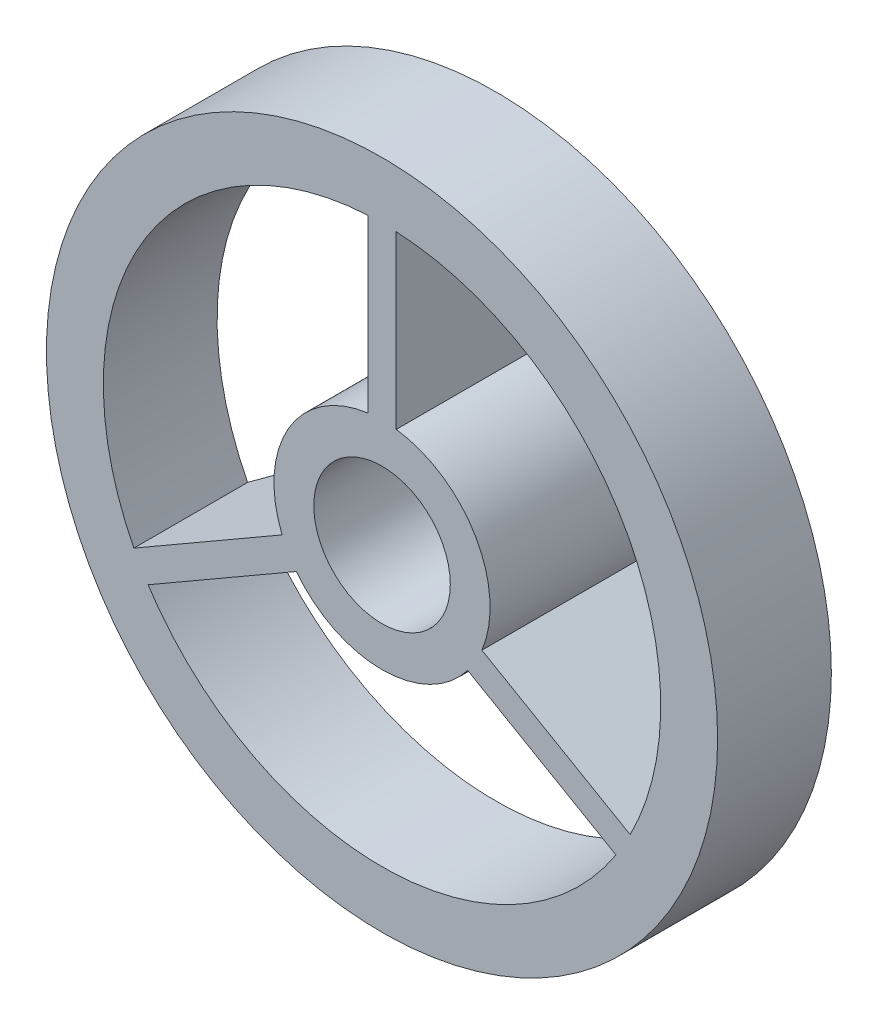
ISO-10303-21;
HEADER;
FILE_DESCRIPTION(('STEP AP214'),'2;1');
FILE_NAME('part.step','',(''),(''),'','','');
FILE_SCHEMA(('AUTOMOTIVE_DESIGN { 1 0 10303 214 1 1 1 1 }'));
ENDSEC;
DATA;
#1=APPLICATION_CONTEXT('core data for automotive mechanical design processes');
#2=APPLICATION_PROTOCOL_DEFINITION('international standard','automotive_design',2000,#1);
#3=PRODUCT_CONTEXT('',#1,'mechanical');
#4=PRODUCT('Part','Part','',(#3));
#5=PRODUCT_RELATED_PRODUCT_CATEGORY('part','',(#4));
#6=PRODUCT_DEFINITION_FORMATION('','',#4);
#7=PRODUCT_DEFINITION_CONTEXT('part definition',#1,'design');
#8=PRODUCT_DEFINITION('design','',#6,#7);
#9=PRODUCT_DEFINITION_SHAPE('','',#8);
#10=(LENGTH_UNIT() NAMED_UNIT(*) SI_UNIT(.MILLI.,.METRE.));
#11=(NAMED_UNIT(*) PLANE_ANGLE_UNIT() SI_UNIT($,.RADIAN.));
#12=(NAMED_UNIT(*) SI_UNIT($,.STERADIAN.) SOLID_ANGLE_UNIT());
#13=UNCERTAINTY_MEASURE_WITH_UNIT(LENGTH_MEASURE(1.E-05),#10,'distance_accuracy_value','');
#14=(GEOMETRIC_REPRESENTATION_CONTEXT(3) GLOBAL_UNCERTAINTY_ASSIGNED_CONTEXT((#13)) GLOBAL_UNIT_ASSIGNED_CONTEXT((#10,
#11,#12)) REPRESENTATION_CONTEXT('',''));
#15=CARTESIAN_POINT('',(0.,0.,0.));
#16=DIRECTION('',(0.,0.,1.));
#17=DIRECTION('',(1.,0.,0.));
#18=AXIS2_PLACEMENT_3D('',#15,#16,#17);
#19=CARTESIAN_POINT('',(0.,0.,-3.5));
#20=DIRECTION('',(0.,0.,1.));
#21=DIRECTION('',(1.,0.,0.));
#22=AXIS2_PLACEMENT_3D('',#19,#20,#21);
#23=CYLINDRICAL_SURFACE('',#22,1.9);
#24=CARTESIAN_POINT('',(0.,0.,0.));
#25=DIRECTION('',(0.,0.,1.));
#26=DIRECTION('',(1.,0.,0.));
#27=AXIS2_PLACEMENT_3D('',#24,#25,#26);
#28=CIRCLE('',#27,1.9);
#29=CARTESIAN_POINT('',(1.75614223781987,-0.725234059145742,0.));
#30=VERTEX_POINT('',#29);
#31=CARTESIAN_POINT('',(0.25,1.88348082018374,0.));
#32=VERTEX_POINT('',#31);
#33=EDGE_CURVE('E353',#30,#32,#28,.T.);
#34=ORIENTED_EDGE('',*,*,#33,.F.);
#35=DIRECTION('',(0.,0.,1.));
#36=VECTOR('',#35,1.);
#37=CARTESIAN_POINT('',(1.75614223781987,-0.725234059145742,-3.5));
#38=LINE('',#37,#36);
#39=CARTESIAN_POINT('',(1.75614223781987,-0.725234059145742,-3.5));
#40=VERTEX_POINT('',#39);
#41=EDGE_CURVE('E219',#30,#40,#38,.F.);
#42=ORIENTED_EDGE('',*,*,#41,.T.);
#43=CARTESIAN_POINT('',(0.,0.,-3.5));
#44=DIRECTION('',(0.,0.,1.));
#45=DIRECTION('',(1.,0.,0.));
#46=AXIS2_PLACEMENT_3D('',#43,#44,#45);
#47=CIRCLE('',#46,1.9);
#48=CARTESIAN_POINT('',(0.25,1.88348082018374,-3.5));
#49=VERTEX_POINT('',#48);
#50=EDGE_CURVE('E342',#40,#49,#47,.T.);
#51=ORIENTED_EDGE('',*,*,#50,.T.);
#52=DIRECTION('',(0.,0.,1.));
#53=VECTOR('',#52,1.);
#54=CARTESIAN_POINT('',(0.25,1.88348082018374,-3.5));
#55=LINE('',#54,#53);
#56=EDGE_CURVE('E333',#32,#49,#55,.F.);
#57=ORIENTED_EDGE('',*,*,#56,.F.);
#58=EDGE_LOOP('',(#34,#42,#51,#57));
#59=FACE_BOUND('',#58,.T.);
#60=ADVANCED_FACE('F49',(#59),#23,.T.);
#61=CARTESIAN_POINT('',(0.,0.,-2.));
#62=DIRECTION('',(0.,0.,1.));
#63=DIRECTION('',(1.,0.,0.));
#64=AXIS2_PLACEMENT_3D('',#61,#62,#63);
#65=PLANE('',#64);
#66=CARTESIAN_POINT('',(0.,0.,-2.));
#67=DIRECTION('',(0.,0.,1.));
#68=DIRECTION('',(1.,0.,0.));
#69=AXIS2_PLACEMENT_3D('',#66,#67,#68);
#70=CIRCLE('',#69,5.9);
#71=CARTESIAN_POINT('',(5.9,0.,-2.));
#72=VERTEX_POINT('',#71);
#73=EDGE_CURVE('E279',#72,#72,#70,.T.);
#74=ORIENTED_EDGE('',*,*,#73,.F.);
#75=EDGE_LOOP('',(#74));
#76=FACE_BOUND('',#75,.T.);
#77=CARTESIAN_POINT('',(0.,0.,-2.));
#78=DIRECTION('',(0.,0.,1.));
#79=DIRECTION('',(1.,0.,0.));
#80=AXIS2_PLACEMENT_3D('',#77,#78,#79);
#81=CIRCLE('',#80,4.9);
#82=CARTESIAN_POINT('',(-4.11299775837599,-2.66331549756954,-2.));
#83=VERTEX_POINT('',#82);
#84=CARTESIAN_POINT('',(4.11299775837603,-2.66331549756949,-2.));
#85=VERTEX_POINT('',#84);
#86=EDGE_CURVE('E280',#83,#85,#81,.T.);
#87=ORIENTED_EDGE('',*,*,#86,.T.);
#88=DIRECTION('',(0.866025403784443,-0.499999999999992,0.));
#89=VECTOR('',#88,1.);
#90=CARTESIAN_POINT('',(-0.124999999999998,-0.216506350946111,-2.));
#91=LINE('',#90,#89);
#92=CARTESIAN_POINT('',(4.11852447854378,-2.66650635094607,-2.));
#93=VERTEX_POINT('',#92);
#94=EDGE_CURVE('E226',#85,#93,#91,.T.);
#95=ORIENTED_EDGE('',*,*,#94,.T.);
#96=DIRECTION('',(0.499999999999992,0.866025403784443,0.));
#97=VECTOR('',#96,1.);
#98=CARTESIAN_POINT('',(4.11852447854378,-2.66650635094607,-2.));
#99=LINE('',#98,#97);
#100=CARTESIAN_POINT('',(4.36852447854377,-2.23349364905385,-2.));
#101=VERTEX_POINT('',#100);
#102=EDGE_CURVE('E65',#93,#101,#99,.T.);
#103=ORIENTED_EDGE('',*,*,#102,.T.);
#104=DIRECTION('',(0.866025403784443,-0.499999999999992,0.));
#105=VECTOR('',#104,1.);
#106=CARTESIAN_POINT('',(0.124999999999998,0.216506350946111,-2.));
#107=LINE('',#106,#105);
#108=CARTESIAN_POINT('',(4.36299775837602,-2.23030279567726,-2.));
#109=VERTEX_POINT('',#108);
#110=EDGE_CURVE('E216',#109,#101,#107,.T.);
#111=ORIENTED_EDGE('',*,*,#110,.F.);
#112=CARTESIAN_POINT('',(0.25,4.89361829324683,-2.));
#113=VERTEX_POINT('',#112);
#114=EDGE_CURVE('E281',#109,#113,#81,.T.);
#115=ORIENTED_EDGE('',*,*,#114,.T.);
#116=DIRECTION('',(0.,-1.,0.));
#117=VECTOR('',#116,1.);
#118=CARTESIAN_POINT('',(0.25,0.,-2.));
#119=LINE('',#118,#117);
#120=CARTESIAN_POINT('',(0.25,4.9,-2.));
#121=VERTEX_POINT('',#120);
#122=EDGE_CURVE('E285',#121,#113,#119,.T.);
#123=ORIENTED_EDGE('',*,*,#122,.F.);
#124=DIRECTION('',(-1.,0.,0.));
#125=VECTOR('',#124,1.);
#126=CARTESIAN_POINT('',(0.25,4.9,-2.));
#127=LINE('',#126,#125);
#128=CARTESIAN_POINT('',(-0.25,4.9,-2.));
#129=VERTEX_POINT('',#128);
#130=EDGE_CURVE('E314',#121,#129,#127,.T.);
#131=ORIENTED_EDGE('',*,*,#130,.T.);
#132=DIRECTION('',(0.,-1.,0.));
#133=VECTOR('',#132,1.);
#134=CARTESIAN_POINT('',(-0.25,0.,-2.));
#135=LINE('',#134,#133);
#136=CARTESIAN_POINT('',(-0.25,4.89361829324683,-2.));
#137=VERTEX_POINT('',#136);
#138=EDGE_CURVE('E348',#129,#137,#135,.T.);
#139=ORIENTED_EDGE('',*,*,#138,.T.);
#140=CARTESIAN_POINT('',(-4.36299775837599,-2.23030279567733,-2.));
#141=VERTEX_POINT('',#140);
#142=EDGE_CURVE('E275',#137,#141,#81,.T.);
#143=ORIENTED_EDGE('',*,*,#142,.T.);
#144=DIRECTION('',(-0.866025403784436,-0.500000000000004,0.));
#145=VECTOR('',#144,1.);
#146=CARTESIAN_POINT('',(-0.125000000000001,0.216506350946109,-2.));
#147=LINE('',#146,#145);
#148=CARTESIAN_POINT('',(-4.36852447854374,-2.23349364905391,-2.));
#149=VERTEX_POINT('',#148);
#150=EDGE_CURVE('E267',#141,#149,#147,.T.);
#151=ORIENTED_EDGE('',*,*,#150,.T.);
#152=DIRECTION('',(0.500000000000004,-0.866025403784436,0.));
#153=VECTOR('',#152,1.);
#154=CARTESIAN_POINT('',(-4.36852447854374,-2.23349364905391,-2.));
#155=LINE('',#154,#153);
#156=CARTESIAN_POINT('',(-4.11852447854374,-2.66650635094613,-2.));
#157=VERTEX_POINT('',#156);
#158=EDGE_CURVE('E243',#149,#157,#155,.T.);
#159=ORIENTED_EDGE('',*,*,#158,.T.);
#160=DIRECTION('',(-0.866025403784436,-0.500000000000004,0.));
#161=VECTOR('',#160,1.);
#162=CARTESIAN_POINT('',(0.125000000000001,-0.216506350946109,-2.));
#163=LINE('',#162,#161);
#164=EDGE_CURVE('E259',#83,#157,#163,.T.);
#165=ORIENTED_EDGE('',*,*,#164,.F.);
#166=EDGE_LOOP('',(#87,#95,#103,#111,#115,#123,#131,#139,#143,#151,#159,#165));
#167=FACE_BOUND('',#166,.T.);
#168=ADVANCED_FACE('F410',(#76,#167),#65,.F.);
#169=CARTESIAN_POINT('',(0.,0.,-2.));
#170=DIRECTION('',(0.,0.,1.));
#171=DIRECTION('',(1.,0.,0.));
#172=AXIS2_PLACEMENT_3D('',#169,#170,#171);
#173=CYLINDRICAL_SURFACE('',#172,4.9);
#174=DIRECTION('',(0.,0.,1.));
#175=VECTOR('',#174,1.);
#176=CARTESIAN_POINT('',(4.36299775837602,-2.23030279567726,-2.));
#177=LINE('',#176,#175);
#178=CARTESIAN_POINT('',(4.36299775837602,-2.23030279567726,0.));
#179=VERTEX_POINT('',#178);
#180=EDGE_CURVE('E195',#179,#109,#177,.F.);
#181=ORIENTED_EDGE('',*,*,#180,.F.);
#182=CARTESIAN_POINT('',(0.,0.,0.));
#183=DIRECTION('',(0.,0.,1.));
#184=DIRECTION('',(1.,0.,0.));
#185=AXIS2_PLACEMENT_3D('',#182,#183,#184);
#186=CIRCLE('',#185,4.9);
#187=CARTESIAN_POINT('',(0.25,4.89361829324683,0.));
#188=VERTEX_POINT('',#187);
#189=EDGE_CURVE('E274',#179,#188,#186,.T.);
#190=ORIENTED_EDGE('',*,*,#189,.T.);
#191=DIRECTION('',(0.,0.,1.));
#192=VECTOR('',#191,1.);
#193=CARTESIAN_POINT('',(0.25,4.89361829324683,-2.));
#194=LINE('',#193,#192);
#195=EDGE_CURVE('E297',#113,#188,#194,.T.);
#196=ORIENTED_EDGE('',*,*,#195,.F.);
#197=ORIENTED_EDGE('',*,*,#114,.F.);
#198=EDGE_LOOP('',(#181,#190,#196,#197));
#199=FACE_BOUND('',#198,.T.);
#200=ADVANCED_FACE('F386',(#199),#173,.F.);
#201=DIRECTION('',(0.,0.,1.));
#202=VECTOR('',#201,1.);
#203=CARTESIAN_POINT('',(1.50614223781988,-1.15824676103796,-3.5));
#204=LINE('',#203,#202);
#205=CARTESIAN_POINT('',(1.50614223781988,-1.15824676103796,0.));
#206=VERTEX_POINT('',#205);
#207=CARTESIAN_POINT('',(1.50614223781988,-1.15824676103796,-3.5));
#208=VERTEX_POINT('',#207);
#209=EDGE_CURVE('E180',#206,#208,#204,.F.);
#210=ORIENTED_EDGE('',*,*,#209,.F.);
#211=CARTESIAN_POINT('',(-1.50614223781986,-1.15824676103798,0.));
#212=VERTEX_POINT('',#211);
#213=EDGE_CURVE('E357',#212,#206,#28,.T.);
#214=ORIENTED_EDGE('',*,*,#213,.F.);
#215=DIRECTION('',(0.,0.,1.));
#216=VECTOR('',#215,1.);
#217=CARTESIAN_POINT('',(-1.50614223781986,-1.15824676103798,-3.5));
#218=LINE('',#217,#216);
#219=CARTESIAN_POINT('',(-1.50614223781986,-1.15824676103798,-3.5));
#220=VERTEX_POINT('',#219);
#221=EDGE_CURVE('E263',#212,#220,#218,.F.);
#222=ORIENTED_EDGE('',*,*,#221,.T.);
#223=EDGE_CURVE('E349',#220,#208,#47,.T.);
#224=ORIENTED_EDGE('',*,*,#223,.T.);
#225=EDGE_LOOP('',(#210,#214,#222,#224));
#226=FACE_BOUND('',#225,.T.);
#227=ADVANCED_FACE('F398',(#226),#23,.T.);
#228=CARTESIAN_POINT('',(-4.11299775837599,-2.66331549756954,0.));
#229=VERTEX_POINT('',#228);
#230=CARTESIAN_POINT('',(4.11299775837603,-2.66331549756949,0.));
#231=VERTEX_POINT('',#230);
#232=EDGE_CURVE('E290',#229,#231,#186,.T.);
#233=ORIENTED_EDGE('',*,*,#232,.T.);
#234=DIRECTION('',(0.,0.,1.));
#235=VECTOR('',#234,1.);
#236=CARTESIAN_POINT('',(4.11299775837603,-2.66331549756949,-2.));
#237=LINE('',#236,#235);
#238=EDGE_CURVE('E223',#231,#85,#237,.F.);
#239=ORIENTED_EDGE('',*,*,#238,.T.);
#240=ORIENTED_EDGE('',*,*,#86,.F.);
#241=DIRECTION('',(0.,0.,1.));
#242=VECTOR('',#241,1.);
#243=CARTESIAN_POINT('',(-4.11299775837599,-2.66331549756954,-2.));
#244=LINE('',#243,#242);
#245=EDGE_CURVE('E58',#229,#83,#244,.F.);
#246=ORIENTED_EDGE('',*,*,#245,.F.);
#247=EDGE_LOOP('',(#233,#239,#240,#246));
#248=FACE_BOUND('',#247,.T.);
#249=ADVANCED_FACE('F372',(#248),#173,.F.);
#250=CARTESIAN_POINT('',(0.25,0.,0.));
#251=DIRECTION('',(1.,0.,0.));
#252=DIRECTION('',(0.,0.,-1.));
#253=AXIS2_PLACEMENT_3D('',#250,#251,#252);
#254=PLANE('',#253);
#255=ORIENTED_EDGE('',*,*,#122,.T.);
#256=ORIENTED_EDGE('',*,*,#195,.T.);
#257=DIRECTION('',(0.,-1.,0.));
#258=VECTOR('',#257,1.);
#259=CARTESIAN_POINT('',(0.25,4.9,0.));
#260=LINE('',#259,#258);
#261=EDGE_CURVE('E302',#188,#32,#260,.T.);
#262=ORIENTED_EDGE('',*,*,#261,.T.);
#263=ORIENTED_EDGE('',*,*,#56,.T.);
#264=DIRECTION('',(0.,1.,0.));
#265=VECTOR('',#264,1.);
#266=CARTESIAN_POINT('',(0.25,1.90340158345198,-3.5));
#267=LINE('',#266,#265);
#268=CARTESIAN_POINT('',(0.25,1.90340158345198,-3.5));
#269=VERTEX_POINT('',#268);
#270=EDGE_CURVE('E306',#49,#269,#267,.T.);
#271=ORIENTED_EDGE('',*,*,#270,.T.);
#272=DIRECTION('',(0.,0.894224083458925,0.447619580181705));
#273=VECTOR('',#272,1.);
#274=CARTESIAN_POINT('',(0.25,1.90340158345198,-3.5));
#275=LINE('',#274,#273);
#276=EDGE_CURVE('E310',#269,#121,#275,.T.);
#277=ORIENTED_EDGE('',*,*,#276,.T.);
#278=EDGE_LOOP('',(#255,#256,#262,#263,#271,#277));
#279=FACE_BOUND('',#278,.T.);
#280=ADVANCED_FACE('F391',(#279),#254,.T.);
#281=CARTESIAN_POINT('',(-0.25,0.,0.));
#282=DIRECTION('',(1.,0.,0.));
#283=DIRECTION('',(0.,0.,-1.));
#284=AXIS2_PLACEMENT_3D('',#281,#282,#283);
#285=PLANE('',#284);
#286=DIRECTION('',(0.,0.,1.));
#287=VECTOR('',#286,1.);
#288=CARTESIAN_POINT('',(-0.25,4.89361829324683,-2.));
#289=LINE('',#288,#287);
#290=CARTESIAN_POINT('',(-0.25,4.89361829324683,0.));
#291=VERTEX_POINT('',#290);
#292=EDGE_CURVE('E360',#137,#291,#289,.T.);
#293=ORIENTED_EDGE('',*,*,#292,.F.);
#294=ORIENTED_EDGE('',*,*,#138,.F.);
#295=DIRECTION('',(0.,0.894224083458925,0.447619580181705));
#296=VECTOR('',#295,1.);
#297=CARTESIAN_POINT('',(-0.25,1.90340158345198,-3.5));
#298=LINE('',#297,#296);
#299=CARTESIAN_POINT('',(-0.25,1.90340158345198,-3.5));
#300=VERTEX_POINT('',#299);
#301=EDGE_CURVE('E307',#300,#129,#298,.T.);
#302=ORIENTED_EDGE('',*,*,#301,.F.);
#303=DIRECTION('',(0.,1.,0.));
#304=VECTOR('',#303,1.);
#305=CARTESIAN_POINT('',(-0.25,1.90340158345198,-3.5));
#306=LINE('',#305,#304);
#307=CARTESIAN_POINT('',(-0.25,1.88348082018374,-3.5));
#308=VERTEX_POINT('',#307);
#309=EDGE_CURVE('E317',#308,#300,#306,.T.);
#310=ORIENTED_EDGE('',*,*,#309,.F.);
#311=DIRECTION('',(0.,0.,1.));
#312=VECTOR('',#311,1.);
#313=CARTESIAN_POINT('',(-0.25,1.88348082018374,-3.5));
#314=LINE('',#313,#312);
#315=CARTESIAN_POINT('',(-0.25,1.88348082018374,0.));
#316=VERTEX_POINT('',#315);
#317=EDGE_CURVE('E329',#316,#308,#314,.F.);
#318=ORIENTED_EDGE('',*,*,#317,.F.);
#319=DIRECTION('',(0.,-1.,0.));
#320=VECTOR('',#319,1.);
#321=CARTESIAN_POINT('',(-0.25,1.90340158345198,0.));
#322=LINE('',#321,#320);
#323=EDGE_CURVE('E301',#291,#316,#322,.T.);
#324=ORIENTED_EDGE('',*,*,#323,.F.);
#325=EDGE_LOOP('',(#293,#294,#302,#310,#318,#324));
#326=FACE_BOUND('',#325,.T.);
#327=ADVANCED_FACE('F414',(#326),#285,.F.);
#328=CARTESIAN_POINT('',(0.,0.,-3.5));
#329=DIRECTION('',(0.,0.,1.));
#330=DIRECTION('',(1.,0.,0.));
#331=AXIS2_PLACEMENT_3D('',#328,#329,#330);
#332=CYLINDRICAL_SURFACE('',#331,1.2);
#333=CARTESIAN_POINT('',(0.,0.,-3.5));
#334=DIRECTION('',(0.,0.,1.));
#335=DIRECTION('',(1.,0.,0.));
#336=AXIS2_PLACEMENT_3D('',#333,#334,#335);
#337=CIRCLE('',#336,1.2);
#338=CARTESIAN_POINT('',(1.2,0.,-3.5));
#339=VERTEX_POINT('',#338);
#340=EDGE_CURVE('E338',#339,#339,#337,.T.);
#341=ORIENTED_EDGE('',*,*,#340,.F.);
#342=EDGE_LOOP('',(#341));
#343=FACE_BOUND('',#342,.T.);
#344=CARTESIAN_POINT('',(0.,0.,0.));
#345=DIRECTION('',(0.,0.,1.));
#346=DIRECTION('',(1.,0.,0.));
#347=AXIS2_PLACEMENT_3D('',#344,#345,#346);
#348=CIRCLE('',#347,1.2);
#349=CARTESIAN_POINT('',(1.2,0.,0.));
#350=VERTEX_POINT('',#349);
#351=EDGE_CURVE('E337',#350,#350,#348,.T.);
#352=ORIENTED_EDGE('',*,*,#351,.T.);
#353=EDGE_LOOP('',(#352));
#354=FACE_BOUND('',#353,.T.);
#355=ADVANCED_FACE('F51',(#343,#354),#332,.F.);
#356=DIRECTION('',(0.,0.,1.));
#357=VECTOR('',#356,1.);
#358=CARTESIAN_POINT('',(-1.75614223781986,-0.725234059145767,-3.5));
#359=LINE('',#358,#357);
#360=CARTESIAN_POINT('',(-1.75614223781986,-0.725234059145766,0.));
#361=VERTEX_POINT('',#360);
#362=CARTESIAN_POINT('',(-1.75614223781986,-0.725234059145766,-3.5));
#363=VERTEX_POINT('',#362);
#364=EDGE_CURVE('E271',#361,#363,#359,.F.);
#365=ORIENTED_EDGE('',*,*,#364,.F.);
#366=EDGE_CURVE('E343',#316,#361,#28,.T.);
#367=ORIENTED_EDGE('',*,*,#366,.F.);
#368=ORIENTED_EDGE('',*,*,#317,.T.);
#369=EDGE_CURVE('E344',#308,#363,#47,.T.);
#370=ORIENTED_EDGE('',*,*,#369,.T.);
#371=EDGE_LOOP('',(#365,#367,#368,#370));
#372=FACE_BOUND('',#371,.T.);
#373=ADVANCED_FACE('F443',(#372),#23,.T.);
#374=CARTESIAN_POINT('',(0.,0.,-3.5));
#375=DIRECTION('',(0.,0.,1.));
#376=DIRECTION('',(1.,0.,0.));
#377=AXIS2_PLACEMENT_3D('',#374,#375,#376);
#378=PLANE('',#377);
#379=ORIENTED_EDGE('',*,*,#50,.F.);
#380=DIRECTION('',(0.866025403784443,-0.499999999999992,0.));
#381=VECTOR('',#380,1.);
#382=CARTESIAN_POINT('',(1.77339412487295,-0.735194440779863,-3.5));
#383=LINE('',#382,#381);
#384=CARTESIAN_POINT('',(1.77339412487295,-0.735194440779863,-3.5));
#385=VERTEX_POINT('',#384);
#386=EDGE_CURVE('E192',#40,#385,#383,.T.);
#387=ORIENTED_EDGE('',*,*,#386,.T.);
#388=DIRECTION('',(0.499999999999992,0.866025403784443,0.));
#389=VECTOR('',#388,1.);
#390=CARTESIAN_POINT('',(1.52339412487295,-1.16820714267208,-3.5));
#391=LINE('',#390,#389);
#392=CARTESIAN_POINT('',(1.52339412487295,-1.16820714267208,-3.5));
#393=VERTEX_POINT('',#392);
#394=EDGE_CURVE('E188',#393,#385,#391,.T.);
#395=ORIENTED_EDGE('',*,*,#394,.F.);
#396=DIRECTION('',(0.866025403784443,-0.499999999999992,0.));
#397=VECTOR('',#396,1.);
#398=CARTESIAN_POINT('',(1.52339412487295,-1.16820714267208,-3.5));
#399=LINE('',#398,#397);
#400=EDGE_CURVE('E174',#208,#393,#399,.T.);
#401=ORIENTED_EDGE('',*,*,#400,.F.);
#402=ORIENTED_EDGE('',*,*,#223,.F.);
#403=DIRECTION('',(-0.866025403784436,-0.500000000000004,0.));
#404=VECTOR('',#403,1.);
#405=CARTESIAN_POINT('',(-1.52339412487293,-1.16820714267211,-3.5));
#406=LINE('',#405,#404);
#407=CARTESIAN_POINT('',(-1.52339412487293,-1.16820714267211,-3.5));
#408=VERTEX_POINT('',#407);
#409=EDGE_CURVE('E247',#220,#408,#406,.T.);
#410=ORIENTED_EDGE('',*,*,#409,.T.);
#411=DIRECTION('',(0.500000000000004,-0.866025403784436,0.));
#412=VECTOR('',#411,1.);
#413=CARTESIAN_POINT('',(-1.77339412487294,-0.735194440779888,-3.5));
#414=LINE('',#413,#412);
#415=CARTESIAN_POINT('',(-1.77339412487294,-0.735194440779888,-3.5));
#416=VERTEX_POINT('',#415);
#417=EDGE_CURVE('E255',#416,#408,#414,.T.);
#418=ORIENTED_EDGE('',*,*,#417,.F.);
#419=DIRECTION('',(-0.866025403784436,-0.500000000000004,0.));
#420=VECTOR('',#419,1.);
#421=CARTESIAN_POINT('',(-1.77339412487294,-0.735194440779888,-3.5));
#422=LINE('',#421,#420);
#423=EDGE_CURVE('E235',#363,#416,#422,.T.);
#424=ORIENTED_EDGE('',*,*,#423,.F.);
#425=ORIENTED_EDGE('',*,*,#369,.F.);
#426=ORIENTED_EDGE('',*,*,#309,.T.);
#427=DIRECTION('',(-1.,0.,0.));
#428=VECTOR('',#427,1.);
#429=CARTESIAN_POINT('',(0.25,1.90340158345198,-3.5));
#430=LINE('',#429,#428);
#431=EDGE_CURVE('E325',#269,#300,#430,.T.);
#432=ORIENTED_EDGE('',*,*,#431,.F.);
#433=ORIENTED_EDGE('',*,*,#270,.F.);
#434=EDGE_LOOP('',(#379,#387,#395,#401,#402,#410,#418,#424,#425,#426,#432,#433));
#435=FACE_BOUND('',#434,.T.);
#436=ORIENTED_EDGE('',*,*,#340,.T.);
#437=EDGE_LOOP('',(#436));
#438=FACE_BOUND('',#437,.T.);
#439=ADVANCED_FACE('F190',(#435,#438),#378,.F.);
#440=CARTESIAN_POINT('',(0.,0.,0.));
#441=DIRECTION('',(0.,0.,1.));
#442=DIRECTION('',(1.,0.,0.));
#443=AXIS2_PLACEMENT_3D('',#440,#441,#442);
#444=PLANE('',#443);
#445=DIRECTION('',(-0.866025403784443,0.499999999999992,0.));
#446=VECTOR('',#445,1.);
#447=CARTESIAN_POINT('',(1.77339412487295,-0.735194440779863,0.));
#448=LINE('',#447,#446);
#449=EDGE_CURVE('E204',#179,#30,#448,.T.);
#450=ORIENTED_EDGE('',*,*,#449,.T.);
#451=ORIENTED_EDGE('',*,*,#33,.T.);
#452=ORIENTED_EDGE('',*,*,#261,.F.);
#453=ORIENTED_EDGE('',*,*,#189,.F.);
#454=EDGE_LOOP('',(#450,#451,#452,#453));
#455=FACE_BOUND('',#454,.T.);
#456=ORIENTED_EDGE('',*,*,#213,.T.);
#457=DIRECTION('',(-0.866025403784443,0.499999999999992,0.));
#458=VECTOR('',#457,1.);
#459=CARTESIAN_POINT('',(4.11852447854378,-2.66650635094607,0.));
#460=LINE('',#459,#458);
#461=EDGE_CURVE('E185',#231,#206,#460,.T.);
#462=ORIENTED_EDGE('',*,*,#461,.F.);
#463=ORIENTED_EDGE('',*,*,#232,.F.);
#464=DIRECTION('',(0.866025403784436,0.500000000000004,0.));
#465=VECTOR('',#464,1.);
#466=CARTESIAN_POINT('',(-1.52339412487293,-1.16820714267211,0.));
#467=LINE('',#466,#465);
#468=EDGE_CURVE('E231',#229,#212,#467,.T.);
#469=ORIENTED_EDGE('',*,*,#468,.T.);
#470=EDGE_LOOP('',(#456,#462,#463,#469));
#471=FACE_BOUND('',#470,.T.);
#472=ORIENTED_EDGE('',*,*,#366,.T.);
#473=DIRECTION('',(0.866025403784436,0.500000000000004,0.));
#474=VECTOR('',#473,1.);
#475=CARTESIAN_POINT('',(-4.36852447854374,-2.23349364905391,0.));
#476=LINE('',#475,#474);
#477=CARTESIAN_POINT('',(-4.36299775837599,-2.23030279567733,0.));
#478=VERTEX_POINT('',#477);
#479=EDGE_CURVE('E232',#478,#361,#476,.T.);
#480=ORIENTED_EDGE('',*,*,#479,.F.);
#481=EDGE_CURVE('E286',#291,#478,#186,.T.);
#482=ORIENTED_EDGE('',*,*,#481,.F.);
#483=ORIENTED_EDGE('',*,*,#323,.T.);
#484=EDGE_LOOP('',(#472,#480,#482,#483));
#485=FACE_BOUND('',#484,.T.);
#486=CARTESIAN_POINT('',(0.,0.,0.));
#487=DIRECTION('',(0.,0.,1.));
#488=DIRECTION('',(1.,0.,0.));
#489=AXIS2_PLACEMENT_3D('',#486,#487,#488);
#490=CIRCLE('',#489,5.9);
#491=CARTESIAN_POINT('',(5.9,0.,0.));
#492=VERTEX_POINT('',#491);
#493=EDGE_CURVE('E289',#492,#492,#490,.T.);
#494=ORIENTED_EDGE('',*,*,#493,.T.);
#495=EDGE_LOOP('',(#494));
#496=FACE_BOUND('',#495,.T.);
#497=ORIENTED_EDGE('',*,*,#351,.F.);
#498=EDGE_LOOP('',(#497));
#499=FACE_BOUND('',#498,.T.);
#500=ADVANCED_FACE('F378',(#455,#471,#485,#496,#499),#444,.T.);
#501=CARTESIAN_POINT('',(0.25,1.90340158345198,-3.5));
#502=DIRECTION('',(0.,-0.447619580181705,0.894224083458925));
#503=DIRECTION('',(0.,-0.894224083458925,-0.447619580181705));
#504=AXIS2_PLACEMENT_3D('',#501,#502,#503);
#505=PLANE('',#504);
#506=ORIENTED_EDGE('',*,*,#301,.T.);
#507=ORIENTED_EDGE('',*,*,#130,.F.);
#508=ORIENTED_EDGE('',*,*,#276,.F.);
#509=ORIENTED_EDGE('',*,*,#431,.T.);
#510=EDGE_LOOP('',(#506,#507,#508,#509));
#511=FACE_BOUND('',#510,.T.);
#512=ADVANCED_FACE('F408',(#511),#505,.F.);
#513=ORIENTED_EDGE('',*,*,#481,.T.);
#514=DIRECTION('',(0.,0.,1.));
#515=VECTOR('',#514,1.);
#516=CARTESIAN_POINT('',(-4.36299775837599,-2.23030279567733,-2.));
#517=LINE('',#516,#515);
#518=EDGE_CURVE('E11',#478,#141,#517,.F.);
#519=ORIENTED_EDGE('',*,*,#518,.T.);
#520=ORIENTED_EDGE('',*,*,#142,.F.);
#521=ORIENTED_EDGE('',*,*,#292,.T.);
#522=EDGE_LOOP('',(#513,#519,#520,#521));
#523=FACE_BOUND('',#522,.T.);
#524=ADVANCED_FACE('F418',(#523),#173,.F.);
#525=CARTESIAN_POINT('',(0.,0.,-2.));
#526=DIRECTION('',(0.,0.,1.));
#527=DIRECTION('',(1.,0.,0.));
#528=AXIS2_PLACEMENT_3D('',#525,#526,#527);
#529=CYLINDRICAL_SURFACE('',#528,5.9);
#530=ORIENTED_EDGE('',*,*,#73,.T.);
#531=EDGE_LOOP('',(#530));
#532=FACE_BOUND('',#531,.T.);
#533=ORIENTED_EDGE('',*,*,#493,.F.);
#534=EDGE_LOOP('',(#533));
#535=FACE_BOUND('',#534,.T.);
#536=ADVANCED_FACE('F470',(#532,#535),#529,.T.);
#537=CARTESIAN_POINT('',(-0.125000000000001,0.216506350946109,0.));
#538=DIRECTION('',(-0.500000000000004,0.866025403784436,0.));
#539=DIRECTION('',(0.,0.,-1.));
#540=AXIS2_PLACEMENT_3D('',#537,#538,#539);
#541=PLANE('',#540);
#542=ORIENTED_EDGE('',*,*,#479,.T.);
#543=ORIENTED_EDGE('',*,*,#364,.T.);
#544=ORIENTED_EDGE('',*,*,#423,.T.);
#545=DIRECTION('',(-0.774420772951283,-0.447112041729466,0.447619580181705));
#546=VECTOR('',#545,1.);
#547=CARTESIAN_POINT('',(-1.77339412487294,-0.735194440779888,-3.5));
#548=LINE('',#547,#546);
#549=EDGE_CURVE('E239',#416,#149,#548,.T.);
#550=ORIENTED_EDGE('',*,*,#549,.T.);
#551=ORIENTED_EDGE('',*,*,#150,.F.);
#552=ORIENTED_EDGE('',*,*,#518,.F.);
#553=EDGE_LOOP('',(#542,#543,#544,#550,#551,#552));
#554=FACE_BOUND('',#553,.T.);
#555=ADVANCED_FACE('F422',(#554),#541,.T.);
#556=CARTESIAN_POINT('',(0.125000000000001,-0.216506350946109,0.));
#557=DIRECTION('',(-0.500000000000004,0.866025403784436,0.));
#558=DIRECTION('',(0.,0.,-1.));
#559=AXIS2_PLACEMENT_3D('',#556,#557,#558);
#560=PLANE('',#559);
#561=ORIENTED_EDGE('',*,*,#221,.F.);
#562=ORIENTED_EDGE('',*,*,#468,.F.);
#563=ORIENTED_EDGE('',*,*,#245,.T.);
#564=ORIENTED_EDGE('',*,*,#164,.T.);
#565=DIRECTION('',(-0.774420772951283,-0.447112041729466,0.447619580181705));
#566=VECTOR('',#565,1.);
#567=CARTESIAN_POINT('',(-1.52339412487293,-1.16820714267211,-3.5));
#568=LINE('',#567,#566);
#569=EDGE_CURVE('E236',#408,#157,#568,.T.);
#570=ORIENTED_EDGE('',*,*,#569,.F.);
#571=ORIENTED_EDGE('',*,*,#409,.F.);
#572=EDGE_LOOP('',(#561,#562,#563,#564,#570,#571));
#573=FACE_BOUND('',#572,.T.);
#574=ADVANCED_FACE('F367',(#573),#560,.F.);
#575=CARTESIAN_POINT('',(-1.77339412487294,-0.735194440779888,-3.5));
#576=DIRECTION('',(0.387649927668681,0.223809790090854,0.894224083458925));
#577=DIRECTION('',(0.917498410047954,0.,-0.397739446823516));
#578=AXIS2_PLACEMENT_3D('',#575,#576,#577);
#579=PLANE('',#578);
#580=ORIENTED_EDGE('',*,*,#569,.T.);
#581=ORIENTED_EDGE('',*,*,#158,.F.);
#582=ORIENTED_EDGE('',*,*,#549,.F.);
#583=ORIENTED_EDGE('',*,*,#417,.T.);
#584=EDGE_LOOP('',(#580,#581,#582,#583));
#585=FACE_BOUND('',#584,.T.);
#586=ADVANCED_FACE('F428',(#585),#579,.F.);
#587=CARTESIAN_POINT('',(-0.124999999999998,-0.216506350946111,0.));
#588=DIRECTION('',(-0.499999999999992,-0.866025403784443,0.));
#589=DIRECTION('',(0.,0.,-1.));
#590=AXIS2_PLACEMENT_3D('',#587,#588,#589);
#591=PLANE('',#590);
#592=ORIENTED_EDGE('',*,*,#461,.T.);
#593=ORIENTED_EDGE('',*,*,#209,.T.);
#594=ORIENTED_EDGE('',*,*,#400,.T.);
#595=DIRECTION('',(0.774420772951289,-0.447112041729455,0.447619580181705));
#596=VECTOR('',#595,1.);
#597=CARTESIAN_POINT('',(1.52339412487295,-1.16820714267208,-3.5));
#598=LINE('',#597,#596);
#599=EDGE_CURVE('E178',#393,#93,#598,.T.);
#600=ORIENTED_EDGE('',*,*,#599,.T.);
#601=ORIENTED_EDGE('',*,*,#94,.F.);
#602=ORIENTED_EDGE('',*,*,#238,.F.);
#603=EDGE_LOOP('',(#592,#593,#594,#600,#601,#602));
#604=FACE_BOUND('',#603,.T.);
#605=ADVANCED_FACE('F176',(#604),#591,.T.);
#606=CARTESIAN_POINT('',(0.124999999999998,0.216506350946111,0.));
#607=DIRECTION('',(-0.499999999999992,-0.866025403784443,0.));
#608=DIRECTION('',(0.,0.,-1.));
#609=AXIS2_PLACEMENT_3D('',#606,#607,#608);
#610=PLANE('',#609);
#611=ORIENTED_EDGE('',*,*,#41,.F.);
#612=ORIENTED_EDGE('',*,*,#449,.F.);
#613=ORIENTED_EDGE('',*,*,#180,.T.);
#614=ORIENTED_EDGE('',*,*,#110,.T.);
#615=DIRECTION('',(0.774420772951289,-0.447112041729455,0.447619580181705));
#616=VECTOR('',#615,1.);
#617=CARTESIAN_POINT('',(1.77339412487295,-0.735194440779863,-3.5));
#618=LINE('',#617,#616);
#619=EDGE_CURVE('E210',#385,#101,#618,.T.);
#620=ORIENTED_EDGE('',*,*,#619,.F.);
#621=ORIENTED_EDGE('',*,*,#386,.F.);
#622=EDGE_LOOP('',(#611,#612,#613,#614,#620,#621));
#623=FACE_BOUND('',#622,.T.);
#624=ADVANCED_FACE('F433',(#623),#610,.F.);
#625=CARTESIAN_POINT('',(1.52339412487295,-1.16820714267208,-3.5));
#626=DIRECTION('',(-0.387649927668684,0.223809790090849,0.894224083458925));
#627=DIRECTION('',(0.917498410047953,0.,0.397739446823519));
#628=AXIS2_PLACEMENT_3D('',#625,#626,#627);
#629=PLANE('',#628);
#630=ORIENTED_EDGE('',*,*,#619,.T.);
#631=ORIENTED_EDGE('',*,*,#102,.F.);
#632=ORIENTED_EDGE('',*,*,#599,.F.);
#633=ORIENTED_EDGE('',*,*,#394,.T.);
#634=EDGE_LOOP('',(#630,#631,#632,#633));
#635=FACE_BOUND('',#634,.T.);
#636=ADVANCED_FACE('F197',(#635),#629,.F.);
#637=CLOSED_SHELL('',(#60,#168,#200,#227,#249,#280,#327,#355,#373,#439,#500,#512,#524,#536,#555,
#574,#586,#605,#624,#636));
#638=MANIFOLD_SOLID_BREP('B2',#637);
#639=ADVANCED_BREP_SHAPE_REPRESENTATION('',(#18,#638),#14);
#640=SHAPE_DEFINITION_REPRESENTATION(#9,#639);
ENDSEC;
END-ISO-10303-21;
